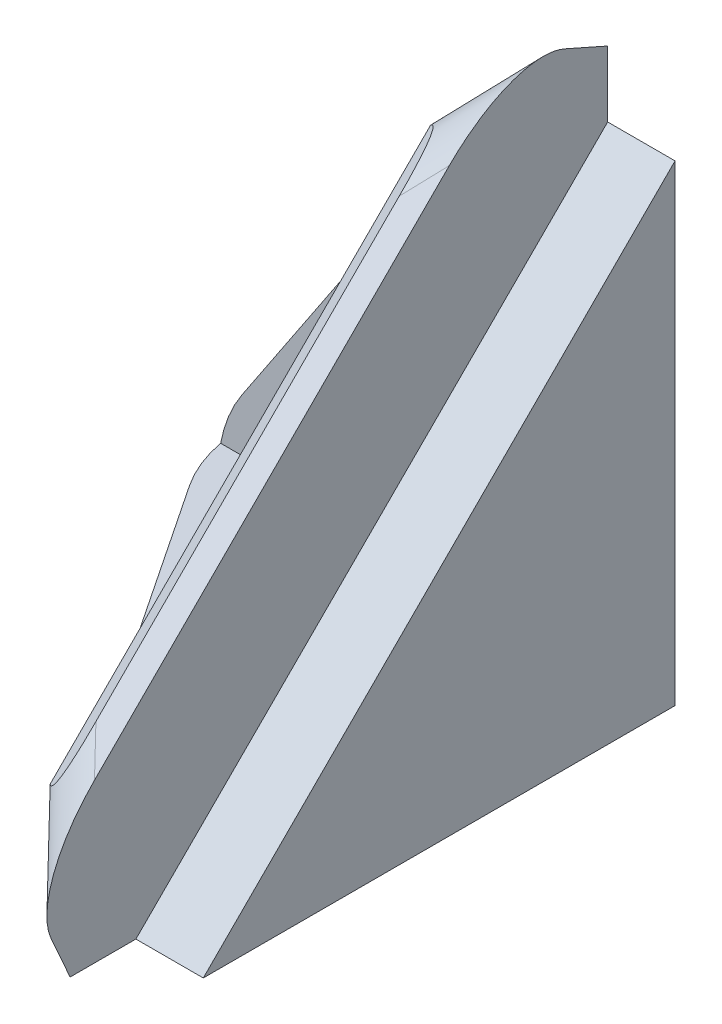
ISO-10303-21;
HEADER;
FILE_DESCRIPTION(('STEP AP214'),'2;1');
FILE_NAME('part.step','',(''),(''),'','','');
FILE_SCHEMA(('AUTOMOTIVE_DESIGN { 1 0 10303 214 1 1 1 1 }'));
ENDSEC;
DATA;
#1=APPLICATION_CONTEXT('core data for automotive mechanical design processes');
#2=APPLICATION_PROTOCOL_DEFINITION('international standard','automotive_design',2000,#1);
#3=PRODUCT_CONTEXT('',#1,'mechanical');
#4=PRODUCT('Part','Part','',(#3));
#5=PRODUCT_RELATED_PRODUCT_CATEGORY('part','',(#4));
#6=PRODUCT_DEFINITION_FORMATION('','',#4);
#7=PRODUCT_DEFINITION_CONTEXT('part definition',#1,'design');
#8=PRODUCT_DEFINITION('design','',#6,#7);
#9=PRODUCT_DEFINITION_SHAPE('','',#8);
#10=(LENGTH_UNIT() NAMED_UNIT(*) SI_UNIT(.MILLI.,.METRE.));
#11=(NAMED_UNIT(*) PLANE_ANGLE_UNIT() SI_UNIT($,.RADIAN.));
#12=(NAMED_UNIT(*) SI_UNIT($,.STERADIAN.) SOLID_ANGLE_UNIT());
#13=UNCERTAINTY_MEASURE_WITH_UNIT(LENGTH_MEASURE(1.E-05),#10,'distance_accuracy_value','');
#14=(GEOMETRIC_REPRESENTATION_CONTEXT(3) GLOBAL_UNCERTAINTY_ASSIGNED_CONTEXT((#13)) GLOBAL_UNIT_ASSIGNED_CONTEXT((#10,
#11,#12)) REPRESENTATION_CONTEXT('',''));
#15=CARTESIAN_POINT('',(0.,0.,0.));
#16=DIRECTION('',(0.,0.,1.));
#17=DIRECTION('',(1.,0.,0.));
#18=AXIS2_PLACEMENT_3D('',#15,#16,#17);
#19=CARTESIAN_POINT('',(0.,25.0502525316942,25.0502525316942));
#20=DIRECTION('',(0.0402110415282764,-0.706534879584586,-0.706534879584586));
#21=DIRECTION('',(0.,-0.707106781186547,0.707106781186547));
#22=AXIS2_PLACEMENT_3D('',#19,#20,#21);
#23=PLANE('',#22);
#24=DIRECTION('',(0.566404975696414,-0.56640497569641,0.598640799655932));
#25=VECTOR('',#24,1.);
#26=CARTESIAN_POINT('',(-12.0796495610013,18.8242886976915,30.5887268953539));
#27=LINE('',#26,#25);
#28=CARTESIAN_POINT('',(-6.85994340570037,13.6045825423906,36.1055023490589));
#29=VERTEX_POINT('',#28);
#30=CARTESIAN_POINT('',(-5.,11.7446391366902,38.071300771529));
#31=VERTEX_POINT('',#30);
#32=EDGE_CURVE('E465',#29,#31,#27,.T.);
#33=ORIENTED_EDGE('',*,*,#32,.T.);
#34=DIRECTION('',(0.,-0.707106781186548,0.707106781186548));
#35=VECTOR('',#34,1.);
#36=CARTESIAN_POINT('',(-5.,24.9079699541096,24.9079699541096));
#37=LINE('',#36,#35);
#38=CARTESIAN_POINT('',(-5.,38.071300771529,11.7446391366902));
#39=VERTEX_POINT('',#38);
#40=EDGE_CURVE('E261',#31,#39,#37,.F.);
#41=ORIENTED_EDGE('',*,*,#40,.T.);
#42=DIRECTION('',(0.566404975696415,0.598640799655932,-0.566404975696409));
#43=VECTOR('',#42,1.);
#44=CARTESIAN_POINT('',(-12.0796495610013,30.5887268953539,18.8242886976915));
#45=LINE('',#44,#43);
#46=CARTESIAN_POINT('',(-6.85994340570037,36.1055023490589,13.6045825423906));
#47=VERTEX_POINT('',#46);
#48=EDGE_CURVE('E522',#39,#47,#45,.F.);
#49=ORIENTED_EDGE('',*,*,#48,.T.);
#50=DIRECTION('',(0.,0.707106781186548,-0.707106781186548));
#51=VECTOR('',#50,1.);
#52=CARTESIAN_POINT('',(-6.85994340570037,-5.14495755427527,54.8550424457247));
#53=LINE('',#52,#51);
#54=EDGE_CURVE('E498',#29,#47,#53,.T.);
#55=ORIENTED_EDGE('',*,*,#54,.F.);
#56=EDGE_LOOP('',(#33,#41,#49,#55));
#57=FACE_BOUND('',#56,.T.);
#58=ADVANCED_FACE('F50',(#57),#23,.F.);
#59=CARTESIAN_POINT('',(-21.8679556319427,0.,14.5786370879618));
#60=DIRECTION('',(0.808003192842465,0.23867712375438,-0.53866879522831));
#61=DIRECTION('',(-0.554700196225229,0.,-0.832050294337844));
#62=AXIS2_PLACEMENT_3D('',#59,#60,#61);
#63=PLANE('',#62);
#64=DIRECTION('',(-0.554700196225229,0.,-0.832050294337844));
#65=VECTOR('',#64,1.);
#66=CARTESIAN_POINT('',(-21.8679556319427,0.,14.5786370879618));
#67=LINE('',#66,#65);
#68=CARTESIAN_POINT('',(-5.,0.,39.8805705358759));
#69=VERTEX_POINT('',#68);
#70=CARTESIAN_POINT('',(-28.9958939606416,0.,3.88672959491346));
#71=VERTEX_POINT('',#70);
#72=EDGE_CURVE('E466',#69,#71,#67,.T.);
#73=ORIENTED_EDGE('',*,*,#72,.F.);
#74=DIRECTION('',(0.,-0.914271575816795,-0.405101821340604));
#75=VECTOR('',#74,1.);
#76=CARTESIAN_POINT('',(-5.,-9.37115503531224,35.7283338555672));
#77=LINE('',#76,#75);
#78=CARTESIAN_POINT('',(-5.,3.17961836342447,41.2894179989949));
#79=VERTEX_POINT('',#78);
#80=EDGE_CURVE('E235',#69,#79,#77,.F.);
#81=ORIENTED_EDGE('',*,*,#80,.T.);
#82=DIRECTION('',(0.566404975696415,-0.56640497569641,0.598640799655932));
#83=VECTOR('',#82,1.);
#84=CARTESIAN_POINT('',(-18.4483264210769,16.6279447845013,27.0757065589623));
#85=LINE('',#84,#83);
#86=CARTESIAN_POINT('',(-9.,7.17961836342444,37.0617658748596));
#87=VERTEX_POINT('',#86);
#88=EDGE_CURVE('E536',#79,#87,#85,.F.);
#89=ORIENTED_EDGE('',*,*,#88,.T.);
#90=DIRECTION('',(0.,-0.914271575816795,-0.405101821340604));
#91=VECTOR('',#90,1.);
#92=CARTESIAN_POINT('',(-9.,-7.14891655193227,30.712978769488));
#93=LINE('',#92,#91);
#94=CARTESIAN_POINT('',(-9.,5.,36.0960053807068));
#95=VERTEX_POINT('',#94);
#96=EDGE_CURVE('E499',#95,#87,#93,.F.);
#97=ORIENTED_EDGE('',*,*,#96,.F.);
#98=DIRECTION('',(-0.554700196225229,0.,-0.832050294337844));
#99=VECTOR('',#98,1.);
#100=CARTESIAN_POINT('',(-22.8904640218647,5.,15.2603093479098));
#101=LINE('',#100,#99);
#102=CARTESIAN_POINT('',(-27.1395171905289,5.,8.88672959491345));
#103=VERTEX_POINT('',#102);
#104=EDGE_CURVE('E478',#103,#95,#101,.F.);
#105=ORIENTED_EDGE('',*,*,#104,.F.);
#106=DIRECTION('',(0.253926469367306,0.683930313758155,0.683930313758154));
#107=VECTOR('',#106,1.);
#108=CARTESIAN_POINT('',(-26.6794518107825,6.23914872011261,10.1258783150261));
#109=LINE('',#108,#107);
#110=EDGE_CURVE('E538',#103,#71,#109,.F.);
#111=ORIENTED_EDGE('',*,*,#110,.T.);
#112=EDGE_LOOP('',(#73,#81,#89,#97,#105,#111));
#113=FACE_BOUND('',#112,.T.);
#114=ADVANCED_FACE('F558',(#113),#63,.F.);
#115=CARTESIAN_POINT('',(-23.6562709283298,15.7708472855532,8.74474632195212));
#116=DIRECTION('',(-0.808003192842464,0.53866879522831,-0.238677123754382));
#117=DIRECTION('',(0.554700196225229,0.832050294337844,0.));
#118=AXIS2_PLACEMENT_3D('',#115,#116,#117);
#119=PLANE('',#118);
#120=DIRECTION('',(-0.566404975696415,-0.598640799655932,0.566404975696409));
#121=VECTOR('',#120,1.);
#122=CARTESIAN_POINT('',(-21.4232398935771,23.9314817436788,19.6028582570014));
#123=LINE('',#122,#121);
#124=CARTESIAN_POINT('',(-9.,37.0617658748596,7.17961836342443));
#125=VERTEX_POINT('',#124);
#126=CARTESIAN_POINT('',(-5.,41.2894179989949,3.17961836342447));
#127=VERTEX_POINT('',#126);
#128=EDGE_CURVE('E462',#125,#127,#123,.F.);
#129=ORIENTED_EDGE('',*,*,#128,.T.);
#130=DIRECTION('',(0.,-0.405101821340606,-0.914271575816794));
#131=VECTOR('',#130,1.);
#132=CARTESIAN_POINT('',(-5.,39.1628031074705,-1.61992448137227));
#133=LINE('',#132,#131);
#134=CARTESIAN_POINT('',(-5.,39.8805705358759,0.));
#135=VERTEX_POINT('',#134);
#136=EDGE_CURVE('E61',#127,#135,#133,.T.);
#137=ORIENTED_EDGE('',*,*,#136,.T.);
#138=DIRECTION('',(0.554700196225229,0.832050294337844,0.));
#139=VECTOR('',#138,1.);
#140=CARTESIAN_POINT('',(5.82435206036499,56.1170986264234,0.));
#141=LINE('',#140,#139);
#142=CARTESIAN_POINT('',(-28.9958939606416,3.88672959491342,0.));
#143=VERTEX_POINT('',#142);
#144=EDGE_CURVE('E463',#143,#135,#141,.T.);
#145=ORIENTED_EDGE('',*,*,#144,.F.);
#146=DIRECTION('',(-0.253926469367306,-0.683930313758155,-0.683930313758153));
#147=VECTOR('',#146,1.);
#148=CARTESIAN_POINT('',(-25.0690285072951,14.4634226363486,10.5766930414351));
#149=LINE('',#148,#147);
#150=CARTESIAN_POINT('',(-27.1395171905289,8.88672959491345,5.));
#151=VERTEX_POINT('',#150);
#152=EDGE_CURVE('E509',#143,#151,#149,.F.);
#153=ORIENTED_EDGE('',*,*,#152,.T.);
#154=DIRECTION('',(-0.554700196225229,-0.832050294337844,0.));
#155=VECTOR('',#154,1.);
#156=CARTESIAN_POINT('',(-22.8904640218647,15.2603093479098,5.));
#157=LINE('',#156,#155);
#158=CARTESIAN_POINT('',(-9.,36.0960053807069,5.));
#159=VERTEX_POINT('',#158);
#160=EDGE_CURVE('E468',#159,#151,#157,.T.);
#161=ORIENTED_EDGE('',*,*,#160,.F.);
#162=DIRECTION('',(0.,-0.405101821340606,-0.914271575816794));
#163=VECTOR('',#162,1.);
#164=CARTESIAN_POINT('',(-9.,34.1474480213914,0.602314002007703));
#165=LINE('',#164,#163);
#166=EDGE_CURVE('E519',#125,#159,#165,.T.);
#167=ORIENTED_EDGE('',*,*,#166,.F.);
#168=EDGE_LOOP('',(#129,#137,#145,#153,#161,#167));
#169=FACE_BOUND('',#168,.T.);
#170=ADVANCED_FACE('F433',(#169),#119,.T.);
#171=CARTESIAN_POINT('',(-14.4083104568646,17.8213304032732,24.3823625828208));
#172=DIRECTION('',(-0.566404975696414,0.56640497569641,-0.598640799655932));
#173=DIRECTION('',(-0.726393819624252,0.,0.687278705338445));
#174=AXIS2_PLACEMENT_3D('',#171,#172,#173);
#175=CYLINDRICAL_SURFACE('',#174,5.);
#176=ORIENTED_EDGE('',*,*,#88,.F.);
#177=CARTESIAN_POINT('',(-5.,8.41301994640867,34.3261285046927));
#178=DIRECTION('',(1.,0.,0.));
#179=DIRECTION('',(0.,0.687278705338442,-0.726393819624255));
#180=AXIS2_PLACEMENT_3D('',#177,#178,#179);
#181=ELLIPSE('',#180,8.82760606728839,5.);
#182=EDGE_CURVE('E266',#79,#31,#181,.F.);
#183=ORIENTED_EDGE('',*,*,#182,.T.);
#184=ORIENTED_EDGE('',*,*,#32,.F.);
#185=CARTESIAN_POINT('',(-11.7638692322829,15.1768891786915,27.1773069728842));
#186=DIRECTION('',(-0.727606875108999,0.485071250072666,0.485071250072666));
#187=DIRECTION('',(-0.302732240434554,0.407478411677827,-0.861576772329658));
#188=AXIS2_PLACEMENT_3D('',#185,#186,#187);
#189=ELLIPSE('',#188,12.610865810412,5.);
#190=CARTESIAN_POINT('',(-9.,9.1386762863587,37.3613237136413));
#191=VERTEX_POINT('',#190);
#192=EDGE_CURVE('E526',#191,#29,#189,.T.);
#193=ORIENTED_EDGE('',*,*,#192,.F.);
#194=CARTESIAN_POINT('',(-9.,12.4130199464086,30.0984763805574));
#195=DIRECTION('',(1.,0.,0.));
#196=DIRECTION('',(0.,0.687278705338442,-0.726393819624255));
#197=AXIS2_PLACEMENT_3D('',#194,#195,#196);
#198=ELLIPSE('',#197,8.82760606728839,5.);
#199=EDGE_CURVE('E537',#87,#191,#198,.F.);
#200=ORIENTED_EDGE('',*,*,#199,.F.);
#201=EDGE_LOOP('',(#176,#183,#184,#193,#200));
#202=FACE_BOUND('',#201,.T.);
#203=ADVANCED_FACE('F580',(#202),#175,.T.);
#204=CARTESIAN_POINT('',(-17.3832239293648,21.2381377675373,20.7962438757733));
#205=DIRECTION('',(-0.566404975696415,-0.598640799655932,0.566404975696409));
#206=DIRECTION('',(0.726393819624252,-0.687278705338446,0.));
#207=AXIS2_PLACEMENT_3D('',#204,#205,#206);
#208=CYLINDRICAL_SURFACE('',#207,5.);
#209=ORIENTED_EDGE('',*,*,#48,.F.);
#210=CARTESIAN_POINT('',(-5.,34.3261285046927,8.41301994640865));
#211=DIRECTION('',(1.,0.,0.));
#212=DIRECTION('',(0.,-0.726393819624255,0.687278705338442));
#213=AXIS2_PLACEMENT_3D('',#210,#211,#212);
#214=ELLIPSE('',#213,8.82760606728838,5.);
#215=EDGE_CURVE('E12',#39,#127,#214,.F.);
#216=ORIENTED_EDGE('',*,*,#215,.T.);
#217=ORIENTED_EDGE('',*,*,#128,.F.);
#218=CARTESIAN_POINT('',(-9.,30.0984763805574,12.4130199464086));
#219=DIRECTION('',(1.,0.,0.));
#220=DIRECTION('',(0.,-0.726393819624255,0.687278705338442));
#221=AXIS2_PLACEMENT_3D('',#218,#219,#220);
#222=ELLIPSE('',#221,8.82760606728838,5.);
#223=CARTESIAN_POINT('',(-9.,37.3613237136413,9.13867628635869));
#224=VERTEX_POINT('',#223);
#225=EDGE_CURVE('E524',#224,#125,#222,.F.);
#226=ORIENTED_EDGE('',*,*,#225,.F.);
#227=CARTESIAN_POINT('',(-11.7638692322829,27.1773069728842,15.1768891786915));
#228=DIRECTION('',(-0.727606875108999,0.485071250072666,0.485071250072666));
#229=DIRECTION('',(-0.302732240434555,-0.861576772329658,0.407478411677826));
#230=AXIS2_PLACEMENT_3D('',#227,#228,#229);
#231=ELLIPSE('',#230,12.610865810412,5.);
#232=EDGE_CURVE('E534',#47,#224,#231,.T.);
#233=ORIENTED_EDGE('',*,*,#232,.F.);
#234=EDGE_LOOP('',(#209,#216,#217,#226,#233));
#235=FACE_BOUND('',#234,.T.);
#236=ADVANCED_FACE('F47',(#235),#208,.T.);
#237=CARTESIAN_POINT('',(-12.,-0.00500999999999974,12.));
#238=DIRECTION('',(0.,1.,0.));
#239=DIRECTION('',(0.,0.,1.));
#240=AXIS2_PLACEMENT_3D('',#237,#238,#239);
#241=CYLINDRICAL_SURFACE('',#240,2.1);
#242=CARTESIAN_POINT('',(-12.,0.,12.));
#243=DIRECTION('',(0.,-1.,0.));
#244=DIRECTION('',(0.,0.,-1.));
#245=AXIS2_PLACEMENT_3D('',#242,#243,#244);
#246=CIRCLE('',#245,2.1);
#247=CARTESIAN_POINT('',(-12.,0.,9.9));
#248=VERTEX_POINT('',#247);
#249=EDGE_CURVE('E323',#248,#248,#246,.T.);
#250=ORIENTED_EDGE('',*,*,#249,.T.);
#251=EDGE_LOOP('',(#250));
#252=FACE_BOUND('',#251,.T.);
#253=CARTESIAN_POINT('',(-12.,2.5,12.));
#254=DIRECTION('',(0.,1.,0.));
#255=DIRECTION('',(0.,0.,1.));
#256=AXIS2_PLACEMENT_3D('',#253,#254,#255);
#257=CIRCLE('',#256,2.1);
#258=CARTESIAN_POINT('',(-12.,2.5,14.1));
#259=VERTEX_POINT('',#258);
#260=EDGE_CURVE('E308',#259,#259,#257,.F.);
#261=ORIENTED_EDGE('',*,*,#260,.F.);
#262=EDGE_LOOP('',(#261));
#263=FACE_BOUND('',#262,.T.);
#264=ADVANCED_FACE('F562',(#252,#263),#241,.F.);
#265=CARTESIAN_POINT('',(-12.,12.,60.00601));
#266=DIRECTION('',(0.,0.,-1.));
#267=DIRECTION('',(-1.,0.,0.));
#268=AXIS2_PLACEMENT_3D('',#265,#266,#267);
#269=CYLINDRICAL_SURFACE('',#268,2.1);
#270=CARTESIAN_POINT('',(-12.,12.,0.));
#271=DIRECTION('',(0.,0.,-1.));
#272=DIRECTION('',(-1.,0.,0.));
#273=AXIS2_PLACEMENT_3D('',#270,#271,#272);
#274=CIRCLE('',#273,2.1);
#275=CARTESIAN_POINT('',(-14.1,12.,0.));
#276=VERTEX_POINT('',#275);
#277=EDGE_CURVE('E372',#276,#276,#274,.T.);
#278=ORIENTED_EDGE('',*,*,#277,.T.);
#279=EDGE_LOOP('',(#278));
#280=FACE_BOUND('',#279,.T.);
#281=CARTESIAN_POINT('',(-12.,12.,2.5));
#282=DIRECTION('',(0.,0.,1.));
#283=DIRECTION('',(1.,0.,0.));
#284=AXIS2_PLACEMENT_3D('',#281,#282,#283);
#285=CIRCLE('',#284,2.1);
#286=CARTESIAN_POINT('',(-9.9,12.,2.5));
#287=VERTEX_POINT('',#286);
#288=EDGE_CURVE('E365',#287,#287,#285,.F.);
#289=ORIENTED_EDGE('',*,*,#288,.F.);
#290=EDGE_LOOP('',(#289));
#291=FACE_BOUND('',#290,.T.);
#292=ADVANCED_FACE('F427',(#280,#291),#269,.F.);
#293=CARTESIAN_POINT('',(0.,0.,60.));
#294=DIRECTION('',(-0.727606875108999,0.485071250072666,0.485071250072666));
#295=DIRECTION('',(0.,0.707106781186547,-0.707106781186547));
#296=AXIS2_PLACEMENT_3D('',#293,#294,#295);
#297=PLANE('',#296);
#298=DIRECTION('',(0.,-0.707106781186547,0.707106781186547));
#299=VECTOR('',#298,1.);
#300=CARTESIAN_POINT('',(-9.,23.25,23.25));
#301=LINE('',#300,#299);
#302=EDGE_CURVE('E397',#224,#191,#301,.T.);
#303=ORIENTED_EDGE('',*,*,#302,.T.);
#304=ORIENTED_EDGE('',*,*,#192,.T.);
#305=ORIENTED_EDGE('',*,*,#54,.T.);
#306=ORIENTED_EDGE('',*,*,#232,.T.);
#307=EDGE_LOOP('',(#303,#304,#305,#306));
#308=FACE_BOUND('',#307,.T.);
#309=ADVANCED_FACE('F423',(#308),#297,.T.);
#310=CARTESIAN_POINT('',(0.,0.,0.));
#311=DIRECTION('',(0.,0.,1.));
#312=DIRECTION('',(1.,0.,0.));
#313=AXIS2_PLACEMENT_3D('',#310,#311,#312);
#314=PLANE('',#313);
#315=ORIENTED_EDGE('',*,*,#277,.F.);
#316=EDGE_LOOP('',(#315));
#317=FACE_BOUND('',#316,.T.);
#318=DIRECTION('',(0.,1.,0.));
#319=VECTOR('',#318,1.);
#320=CARTESIAN_POINT('',(-5.,0.,0.));
#321=LINE('',#320,#319);
#322=CARTESIAN_POINT('',(-5.,35.,0.));
#323=VERTEX_POINT('',#322);
#324=EDGE_CURVE('E245',#323,#135,#321,.T.);
#325=ORIENTED_EDGE('',*,*,#324,.F.);
#326=DIRECTION('',(1.,0.,0.));
#327=VECTOR('',#326,1.);
#328=CARTESIAN_POINT('',(-5.,35.,0.));
#329=LINE('',#328,#327);
#330=CARTESIAN_POINT('',(0.,35.,0.));
#331=VERTEX_POINT('',#330);
#332=EDGE_CURVE('E244',#323,#331,#329,.T.);
#333=ORIENTED_EDGE('',*,*,#332,.T.);
#334=DIRECTION('',(0.,1.,0.));
#335=VECTOR('',#334,1.);
#336=CARTESIAN_POINT('',(0.,60.,0.));
#337=LINE('',#336,#335);
#338=CARTESIAN_POINT('',(0.,0.,0.));
#339=VERTEX_POINT('',#338);
#340=EDGE_CURVE('E496',#339,#331,#337,.T.);
#341=ORIENTED_EDGE('',*,*,#340,.F.);
#342=DIRECTION('',(1.,0.,0.));
#343=VECTOR('',#342,1.);
#344=CARTESIAN_POINT('',(0.,0.,0.));
#345=LINE('',#344,#343);
#346=CARTESIAN_POINT('',(-30.5683885482844,0.,0.));
#347=VERTEX_POINT('',#346);
#348=EDGE_CURVE('E457',#347,#339,#345,.T.);
#349=ORIENTED_EDGE('',*,*,#348,.F.);
#350=CARTESIAN_POINT('',(-25.3989526645243,0.,0.));
#351=DIRECTION('',(0.,0.,1.));
#352=DIRECTION('',(-0.34806030307073,-0.937472146480263,0.));
#353=AXIS2_PLACEMENT_3D('',#350,#351,#352);
#354=ELLIPSE('',#353,7.31068633663175,5.);
#355=EDGE_CURVE('E57',#347,#143,#354,.F.);
#356=ORIENTED_EDGE('',*,*,#355,.T.);
#357=ORIENTED_EDGE('',*,*,#144,.T.);
#358=EDGE_LOOP('',(#325,#333,#341,#349,#356,#357));
#359=FACE_BOUND('',#358,.T.);
#360=ADVANCED_FACE('F430',(#317,#359),#314,.F.);
#361=CARTESIAN_POINT('',(0.,0.,0.));
#362=DIRECTION('',(1.,0.,0.));
#363=DIRECTION('',(0.,0.,-1.));
#364=AXIS2_PLACEMENT_3D('',#361,#362,#363);
#365=PLANE('',#364);
#366=DIRECTION('',(0.,0.707106781186548,-0.707106781186548));
#367=VECTOR('',#366,1.);
#368=CARTESIAN_POINT('',(0.,17.5,17.5));
#369=LINE('',#368,#367);
#370=CARTESIAN_POINT('',(0.,0.,35.));
#371=VERTEX_POINT('',#370);
#372=EDGE_CURVE('E237',#371,#331,#369,.T.);
#373=ORIENTED_EDGE('',*,*,#372,.F.);
#374=DIRECTION('',(0.,0.,-1.));
#375=VECTOR('',#374,1.);
#376=CARTESIAN_POINT('',(0.,0.,60.));
#377=LINE('',#376,#375);
#378=EDGE_CURVE('E250',#371,#339,#377,.T.);
#379=ORIENTED_EDGE('',*,*,#378,.T.);
#380=ORIENTED_EDGE('',*,*,#340,.T.);
#381=EDGE_LOOP('',(#373,#379,#380));
#382=FACE_BOUND('',#381,.T.);
#383=ADVANCED_FACE('F419',(#382),#365,.T.);
#384=CARTESIAN_POINT('',(0.,0.,0.));
#385=DIRECTION('',(0.,-1.,0.));
#386=DIRECTION('',(0.,0.,1.));
#387=AXIS2_PLACEMENT_3D('',#384,#385,#386);
#388=PLANE('',#387);
#389=DIRECTION('',(1.,0.,0.));
#390=VECTOR('',#389,1.);
#391=CARTESIAN_POINT('',(-5.,0.,35.));
#392=LINE('',#391,#390);
#393=CARTESIAN_POINT('',(-5.,0.,35.));
#394=VERTEX_POINT('',#393);
#395=EDGE_CURVE('E236',#394,#371,#392,.T.);
#396=ORIENTED_EDGE('',*,*,#395,.F.);
#397=DIRECTION('',(0.,0.,1.));
#398=VECTOR('',#397,1.);
#399=CARTESIAN_POINT('',(-5.,0.,0.));
#400=LINE('',#399,#398);
#401=EDGE_CURVE('E227',#394,#69,#400,.T.);
#402=ORIENTED_EDGE('',*,*,#401,.T.);
#403=ORIENTED_EDGE('',*,*,#72,.T.);
#404=CARTESIAN_POINT('',(-25.3989526645243,0.,0.));
#405=DIRECTION('',(0.,-1.,0.));
#406=DIRECTION('',(-0.348060303070731,0.,-0.937472146480263));
#407=AXIS2_PLACEMENT_3D('',#404,#405,#406);
#408=ELLIPSE('',#407,7.31068633663173,5.);
#409=EDGE_CURVE('E459',#71,#347,#408,.T.);
#410=ORIENTED_EDGE('',*,*,#409,.T.);
#411=ORIENTED_EDGE('',*,*,#348,.T.);
#412=ORIENTED_EDGE('',*,*,#378,.F.);
#413=EDGE_LOOP('',(#396,#402,#403,#410,#411,#412));
#414=FACE_BOUND('',#413,.T.);
#415=ORIENTED_EDGE('',*,*,#249,.F.);
#416=EDGE_LOOP('',(#415));
#417=FACE_BOUND('',#416,.T.);
#418=ADVANCED_FACE('F248',(#414,#417),#388,.T.);
#419=CARTESIAN_POINT('',(0.,0.,5.));
#420=DIRECTION('',(0.,0.,1.));
#421=DIRECTION('',(1.,0.,0.));
#422=AXIS2_PLACEMENT_3D('',#419,#420,#421);
#423=PLANE('',#422);
#424=DIRECTION('',(-0.866025403784439,0.5,0.));
#425=VECTOR('',#424,1.);
#426=CARTESIAN_POINT('',(-8.5,14.0207259421637,5.));
#427=LINE('',#426,#425);
#428=CARTESIAN_POINT('',(-8.5,14.0207259421637,5.));
#429=VERTEX_POINT('',#428);
#430=CARTESIAN_POINT('',(-12.,16.0414518843274,5.));
#431=VERTEX_POINT('',#430);
#432=EDGE_CURVE('E325',#429,#431,#427,.T.);
#433=ORIENTED_EDGE('',*,*,#432,.F.);
#434=DIRECTION('',(0.,1.,0.));
#435=VECTOR('',#434,1.);
#436=CARTESIAN_POINT('',(-8.5,9.97927405783631,5.));
#437=LINE('',#436,#435);
#438=CARTESIAN_POINT('',(-8.5,9.97927405783631,5.));
#439=VERTEX_POINT('',#438);
#440=EDGE_CURVE('E329',#439,#429,#437,.T.);
#441=ORIENTED_EDGE('',*,*,#440,.F.);
#442=DIRECTION('',(0.866025403784439,0.5,0.));
#443=VECTOR('',#442,1.);
#444=CARTESIAN_POINT('',(-12.,7.95854811567262,5.));
#445=LINE('',#444,#443);
#446=CARTESIAN_POINT('',(-12.,7.95854811567262,5.));
#447=VERTEX_POINT('',#446);
#448=EDGE_CURVE('E354',#447,#439,#445,.T.);
#449=ORIENTED_EDGE('',*,*,#448,.F.);
#450=DIRECTION('',(0.866025403784438,-0.5,0.));
#451=VECTOR('',#450,1.);
#452=CARTESIAN_POINT('',(-15.5,9.97927405783631,5.));
#453=LINE('',#452,#451);
#454=CARTESIAN_POINT('',(-15.5,9.97927405783631,5.));
#455=VERTEX_POINT('',#454);
#456=EDGE_CURVE('E355',#455,#447,#453,.T.);
#457=ORIENTED_EDGE('',*,*,#456,.F.);
#458=DIRECTION('',(0.,-1.,0.));
#459=VECTOR('',#458,1.);
#460=CARTESIAN_POINT('',(-15.5,14.0207259421637,5.));
#461=LINE('',#460,#459);
#462=CARTESIAN_POINT('',(-15.5,14.0207259421637,5.));
#463=VERTEX_POINT('',#462);
#464=EDGE_CURVE('E347',#463,#455,#461,.T.);
#465=ORIENTED_EDGE('',*,*,#464,.F.);
#466=DIRECTION('',(-0.866025403784438,-0.5,0.));
#467=VECTOR('',#466,1.);
#468=CARTESIAN_POINT('',(-12.,16.0414518843274,5.));
#469=LINE('',#468,#467);
#470=EDGE_CURVE('E346',#431,#463,#469,.T.);
#471=ORIENTED_EDGE('',*,*,#470,.F.);
#472=EDGE_LOOP('',(#433,#441,#449,#457,#465,#471));
#473=FACE_BOUND('',#472,.T.);
#474=ORIENTED_EDGE('',*,*,#160,.T.);
#475=CARTESIAN_POINT('',(-23.5425758944116,4.99999999999999,5.));
#476=DIRECTION('',(0.,0.,1.));
#477=DIRECTION('',(-0.34806030307073,-0.937472146480263,0.));
#478=AXIS2_PLACEMENT_3D('',#475,#476,#477);
#479=ELLIPSE('',#478,7.31068633663175,5.);
#480=CARTESIAN_POINT('',(-28.7120117781717,5.,5.));
#481=VERTEX_POINT('',#480);
#482=EDGE_CURVE('E73',#151,#481,#479,.T.);
#483=ORIENTED_EDGE('',*,*,#482,.T.);
#484=DIRECTION('',(1.,0.,0.));
#485=VECTOR('',#484,1.);
#486=CARTESIAN_POINT('',(0.,5.,5.));
#487=LINE('',#486,#485);
#488=CARTESIAN_POINT('',(-4.,5.,5.));
#489=VERTEX_POINT('',#488);
#490=EDGE_CURVE('E399',#481,#489,#487,.T.);
#491=ORIENTED_EDGE('',*,*,#490,.T.);
#492=DIRECTION('',(0.,-1.,0.));
#493=VECTOR('',#492,1.);
#494=CARTESIAN_POINT('',(-4.,22.5,5.));
#495=LINE('',#494,#493);
#496=CARTESIAN_POINT('',(-4.,22.5,5.));
#497=VERTEX_POINT('',#496);
#498=EDGE_CURVE('E380',#497,#489,#495,.T.);
#499=ORIENTED_EDGE('',*,*,#498,.F.);
#500=DIRECTION('',(-1.,0.,0.));
#501=VECTOR('',#500,1.);
#502=CARTESIAN_POINT('',(-4.,22.5,5.));
#503=LINE('',#502,#501);
#504=CARTESIAN_POINT('',(-9.,22.5,5.));
#505=VERTEX_POINT('',#504);
#506=EDGE_CURVE('E386',#497,#505,#503,.T.);
#507=ORIENTED_EDGE('',*,*,#506,.T.);
#508=DIRECTION('',(0.,1.,0.));
#509=VECTOR('',#508,1.);
#510=CARTESIAN_POINT('',(-9.,0.,5.));
#511=LINE('',#510,#509);
#512=EDGE_CURVE('E391',#505,#159,#511,.T.);
#513=ORIENTED_EDGE('',*,*,#512,.T.);
#514=EDGE_LOOP('',(#474,#483,#491,#499,#507,#513));
#515=FACE_BOUND('',#514,.T.);
#516=ADVANCED_FACE('F417',(#473,#515),#423,.T.);
#517=CARTESIAN_POINT('',(-9.,0.,0.));
#518=DIRECTION('',(1.,0.,0.));
#519=DIRECTION('',(0.,0.,-1.));
#520=AXIS2_PLACEMENT_3D('',#517,#518,#519);
#521=PLANE('',#520);
#522=ORIENTED_EDGE('',*,*,#96,.T.);
#523=ORIENTED_EDGE('',*,*,#199,.T.);
#524=ORIENTED_EDGE('',*,*,#302,.F.);
#525=ORIENTED_EDGE('',*,*,#225,.T.);
#526=ORIENTED_EDGE('',*,*,#166,.T.);
#527=ORIENTED_EDGE('',*,*,#512,.F.);
#528=DIRECTION('',(0.,0.707106781186548,-0.707106781186548));
#529=VECTOR('',#528,1.);
#530=CARTESIAN_POINT('',(-9.,22.5,5.));
#531=LINE('',#530,#529);
#532=CARTESIAN_POINT('',(-9.,5.,22.5));
#533=VERTEX_POINT('',#532);
#534=EDGE_CURVE('E377',#533,#505,#531,.T.);
#535=ORIENTED_EDGE('',*,*,#534,.F.);
#536=DIRECTION('',(0.,0.,-1.));
#537=VECTOR('',#536,1.);
#538=CARTESIAN_POINT('',(-9.,5.,0.));
#539=LINE('',#538,#537);
#540=EDGE_CURVE('E392',#95,#533,#539,.T.);
#541=ORIENTED_EDGE('',*,*,#540,.F.);
#542=EDGE_LOOP('',(#522,#523,#524,#525,#526,#527,#535,#541));
#543=FACE_BOUND('',#542,.T.);
#544=ADVANCED_FACE('F554',(#543),#521,.F.);
#545=CARTESIAN_POINT('',(0.,5.,0.));
#546=DIRECTION('',(0.,-1.,0.));
#547=DIRECTION('',(0.,0.,1.));
#548=AXIS2_PLACEMENT_3D('',#545,#546,#547);
#549=PLANE('',#548);
#550=DIRECTION('',(-0.866025403784439,0.,0.5));
#551=VECTOR('',#550,1.);
#552=CARTESIAN_POINT('',(-12.,5.,7.95854811567262));
#553=LINE('',#552,#551);
#554=CARTESIAN_POINT('',(-12.,5.,7.95854811567262));
#555=VERTEX_POINT('',#554);
#556=CARTESIAN_POINT('',(-15.5,5.,9.97927405783631));
#557=VERTEX_POINT('',#556);
#558=EDGE_CURVE('E291',#555,#557,#553,.T.);
#559=ORIENTED_EDGE('',*,*,#558,.F.);
#560=DIRECTION('',(-0.866025403784439,0.,-0.5));
#561=VECTOR('',#560,1.);
#562=CARTESIAN_POINT('',(-8.5,5.,9.97927405783631));
#563=LINE('',#562,#561);
#564=CARTESIAN_POINT('',(-8.5,5.,9.97927405783631));
#565=VERTEX_POINT('',#564);
#566=EDGE_CURVE('E269',#565,#555,#563,.T.);
#567=ORIENTED_EDGE('',*,*,#566,.F.);
#568=DIRECTION('',(0.,0.,-1.));
#569=VECTOR('',#568,1.);
#570=CARTESIAN_POINT('',(-8.5,5.,14.0207259421637));
#571=LINE('',#570,#569);
#572=CARTESIAN_POINT('',(-8.5,5.,14.0207259421637));
#573=VERTEX_POINT('',#572);
#574=EDGE_CURVE('E280',#573,#565,#571,.T.);
#575=ORIENTED_EDGE('',*,*,#574,.F.);
#576=DIRECTION('',(0.866025403784439,0.,-0.5));
#577=VECTOR('',#576,1.);
#578=CARTESIAN_POINT('',(-12.,5.,16.0414518843274));
#579=LINE('',#578,#577);
#580=CARTESIAN_POINT('',(-12.,5.,16.0414518843274));
#581=VERTEX_POINT('',#580);
#582=EDGE_CURVE('E303',#581,#573,#579,.T.);
#583=ORIENTED_EDGE('',*,*,#582,.F.);
#584=DIRECTION('',(0.866025403784439,0.,0.5));
#585=VECTOR('',#584,1.);
#586=CARTESIAN_POINT('',(-15.5,5.,14.0207259421637));
#587=LINE('',#586,#585);
#588=CARTESIAN_POINT('',(-15.5,5.,14.0207259421637));
#589=VERTEX_POINT('',#588);
#590=EDGE_CURVE('E296',#589,#581,#587,.T.);
#591=ORIENTED_EDGE('',*,*,#590,.F.);
#592=DIRECTION('',(0.,0.,1.));
#593=VECTOR('',#592,1.);
#594=CARTESIAN_POINT('',(-15.5,5.,9.97927405783631));
#595=LINE('',#594,#593);
#596=EDGE_CURVE('E299',#557,#589,#595,.T.);
#597=ORIENTED_EDGE('',*,*,#596,.F.);
#598=EDGE_LOOP('',(#559,#567,#575,#583,#591,#597));
#599=FACE_BOUND('',#598,.T.);
#600=ORIENTED_EDGE('',*,*,#490,.F.);
#601=CARTESIAN_POINT('',(-23.5425758944116,5.,5.00000000000001));
#602=DIRECTION('',(0.,-1.,0.));
#603=DIRECTION('',(-0.348060303070731,0.,-0.937472146480263));
#604=AXIS2_PLACEMENT_3D('',#601,#602,#603);
#605=ELLIPSE('',#604,7.31068633663173,5.);
#606=EDGE_CURVE('E507',#481,#103,#605,.F.);
#607=ORIENTED_EDGE('',*,*,#606,.T.);
#608=ORIENTED_EDGE('',*,*,#104,.T.);
#609=ORIENTED_EDGE('',*,*,#540,.T.);
#610=DIRECTION('',(-1.,0.,0.));
#611=VECTOR('',#610,1.);
#612=CARTESIAN_POINT('',(-4.,5.,22.5));
#613=LINE('',#612,#611);
#614=CARTESIAN_POINT('',(-4.,5.,22.5));
#615=VERTEX_POINT('',#614);
#616=EDGE_CURVE('E387',#615,#533,#613,.T.);
#617=ORIENTED_EDGE('',*,*,#616,.F.);
#618=DIRECTION('',(0.,0.,1.));
#619=VECTOR('',#618,1.);
#620=CARTESIAN_POINT('',(-4.,5.,5.));
#621=LINE('',#620,#619);
#622=EDGE_CURVE('E376',#489,#615,#621,.T.);
#623=ORIENTED_EDGE('',*,*,#622,.F.);
#624=EDGE_LOOP('',(#600,#607,#608,#609,#617,#623));
#625=FACE_BOUND('',#624,.T.);
#626=ADVANCED_FACE('F547',(#599,#625),#549,.F.);
#627=CARTESIAN_POINT('',(-4.,22.5,5.));
#628=DIRECTION('',(0.,0.707106781186548,0.707106781186548));
#629=DIRECTION('',(0.,-0.707106781186548,0.707106781186548));
#630=AXIS2_PLACEMENT_3D('',#627,#628,#629);
#631=PLANE('',#630);
#632=ORIENTED_EDGE('',*,*,#534,.T.);
#633=ORIENTED_EDGE('',*,*,#506,.F.);
#634=DIRECTION('',(0.,0.707106781186548,-0.707106781186548));
#635=VECTOR('',#634,1.);
#636=CARTESIAN_POINT('',(-4.,22.5,5.));
#637=LINE('',#636,#635);
#638=EDGE_CURVE('E381',#615,#497,#637,.T.);
#639=ORIENTED_EDGE('',*,*,#638,.F.);
#640=ORIENTED_EDGE('',*,*,#616,.T.);
#641=EDGE_LOOP('',(#632,#633,#639,#640));
#642=FACE_BOUND('',#641,.T.);
#643=ADVANCED_FACE('F606',(#642),#631,.F.);
#644=CARTESIAN_POINT('',(-4.,0.,0.));
#645=DIRECTION('',(-1.,0.,0.));
#646=DIRECTION('',(0.,0.,1.));
#647=AXIS2_PLACEMENT_3D('',#644,#645,#646);
#648=PLANE('',#647);
#649=ORIENTED_EDGE('',*,*,#498,.T.);
#650=ORIENTED_EDGE('',*,*,#622,.T.);
#651=ORIENTED_EDGE('',*,*,#638,.T.);
#652=EDGE_LOOP('',(#649,#650,#651));
#653=FACE_BOUND('',#652,.T.);
#654=ADVANCED_FACE('F612',(#653),#648,.T.);
#655=CARTESIAN_POINT('',(0.,0.,2.5));
#656=DIRECTION('',(0.,0.,1.));
#657=DIRECTION('',(1.,0.,0.));
#658=AXIS2_PLACEMENT_3D('',#655,#656,#657);
#659=PLANE('',#658);
#660=DIRECTION('',(-0.866025403784439,0.5,0.));
#661=VECTOR('',#660,1.);
#662=CARTESIAN_POINT('',(-8.5,14.0207259421637,2.5));
#663=LINE('',#662,#661);
#664=CARTESIAN_POINT('',(-8.5,14.0207259421637,2.5));
#665=VERTEX_POINT('',#664);
#666=CARTESIAN_POINT('',(-12.,16.0414518843274,2.5));
#667=VERTEX_POINT('',#666);
#668=EDGE_CURVE('E321',#665,#667,#663,.T.);
#669=ORIENTED_EDGE('',*,*,#668,.T.);
#670=DIRECTION('',(-0.866025403784438,-0.5,0.));
#671=VECTOR('',#670,1.);
#672=CARTESIAN_POINT('',(-12.,16.0414518843274,2.5));
#673=LINE('',#672,#671);
#674=CARTESIAN_POINT('',(-15.5,14.0207259421637,2.5));
#675=VERTEX_POINT('',#674);
#676=EDGE_CURVE('E328',#667,#675,#673,.T.);
#677=ORIENTED_EDGE('',*,*,#676,.T.);
#678=DIRECTION('',(0.,-1.,0.));
#679=VECTOR('',#678,1.);
#680=CARTESIAN_POINT('',(-15.5,14.0207259421637,2.5));
#681=LINE('',#680,#679);
#682=CARTESIAN_POINT('',(-15.5,9.97927405783631,2.5));
#683=VERTEX_POINT('',#682);
#684=EDGE_CURVE('E332',#675,#683,#681,.T.);
#685=ORIENTED_EDGE('',*,*,#684,.T.);
#686=DIRECTION('',(0.866025403784438,-0.5,0.));
#687=VECTOR('',#686,1.);
#688=CARTESIAN_POINT('',(-15.5,9.97927405783631,2.5));
#689=LINE('',#688,#687);
#690=CARTESIAN_POINT('',(-12.,7.95854811567262,2.5));
#691=VERTEX_POINT('',#690);
#692=EDGE_CURVE('E334',#683,#691,#689,.T.);
#693=ORIENTED_EDGE('',*,*,#692,.T.);
#694=DIRECTION('',(0.866025403784439,0.5,0.));
#695=VECTOR('',#694,1.);
#696=CARTESIAN_POINT('',(-12.,7.95854811567262,2.5));
#697=LINE('',#696,#695);
#698=CARTESIAN_POINT('',(-8.5,9.97927405783631,2.5));
#699=VERTEX_POINT('',#698);
#700=EDGE_CURVE('E336',#691,#699,#697,.T.);
#701=ORIENTED_EDGE('',*,*,#700,.T.);
#702=DIRECTION('',(0.,1.,0.));
#703=VECTOR('',#702,1.);
#704=CARTESIAN_POINT('',(-8.5,9.97927405783631,2.5));
#705=LINE('',#704,#703);
#706=EDGE_CURVE('E341',#699,#665,#705,.T.);
#707=ORIENTED_EDGE('',*,*,#706,.T.);
#708=EDGE_LOOP('',(#669,#677,#685,#693,#701,#707));
#709=FACE_BOUND('',#708,.T.);
#710=ORIENTED_EDGE('',*,*,#288,.T.);
#711=EDGE_LOOP('',(#710));
#712=FACE_BOUND('',#711,.T.);
#713=ADVANCED_FACE('F614',(#709,#712),#659,.T.);
#714=CARTESIAN_POINT('',(-8.5,14.0207259421637,2.5));
#715=DIRECTION('',(0.5,0.866025403784439,0.));
#716=DIRECTION('',(-0.866025403784439,0.5,0.));
#717=AXIS2_PLACEMENT_3D('',#714,#715,#716);
#718=PLANE('',#717);
#719=ORIENTED_EDGE('',*,*,#432,.T.);
#720=DIRECTION('',(0.,0.,1.));
#721=VECTOR('',#720,1.);
#722=CARTESIAN_POINT('',(-12.,16.0414518843274,2.5));
#723=LINE('',#722,#721);
#724=EDGE_CURVE('E342',#667,#431,#723,.T.);
#725=ORIENTED_EDGE('',*,*,#724,.F.);
#726=ORIENTED_EDGE('',*,*,#668,.F.);
#727=DIRECTION('',(0.,0.,1.));
#728=VECTOR('',#727,1.);
#729=CARTESIAN_POINT('',(-8.5,14.0207259421637,2.5));
#730=LINE('',#729,#728);
#731=EDGE_CURVE('E358',#665,#429,#730,.T.);
#732=ORIENTED_EDGE('',*,*,#731,.T.);
#733=EDGE_LOOP('',(#719,#725,#726,#732));
#734=FACE_BOUND('',#733,.T.);
#735=ADVANCED_FACE('F616',(#734),#718,.F.);
#736=CARTESIAN_POINT('',(-8.5,9.97927405783631,2.5));
#737=DIRECTION('',(1.,0.,0.));
#738=DIRECTION('',(0.,0.,-1.));
#739=AXIS2_PLACEMENT_3D('',#736,#737,#738);
#740=PLANE('',#739);
#741=ORIENTED_EDGE('',*,*,#440,.T.);
#742=ORIENTED_EDGE('',*,*,#731,.F.);
#743=ORIENTED_EDGE('',*,*,#706,.F.);
#744=DIRECTION('',(0.,0.,1.));
#745=VECTOR('',#744,1.);
#746=CARTESIAN_POINT('',(-8.5,9.97927405783631,2.5));
#747=LINE('',#746,#745);
#748=EDGE_CURVE('E364',#699,#439,#747,.T.);
#749=ORIENTED_EDGE('',*,*,#748,.T.);
#750=EDGE_LOOP('',(#741,#742,#743,#749));
#751=FACE_BOUND('',#750,.T.);
#752=ADVANCED_FACE('F733',(#751),#740,.F.);
#753=CARTESIAN_POINT('',(-12.,7.95854811567262,2.5));
#754=DIRECTION('',(0.5,-0.866025403784438,0.));
#755=DIRECTION('',(0.866025403784439,0.5,0.));
#756=AXIS2_PLACEMENT_3D('',#753,#754,#755);
#757=PLANE('',#756);
#758=ORIENTED_EDGE('',*,*,#448,.T.);
#759=ORIENTED_EDGE('',*,*,#748,.F.);
#760=ORIENTED_EDGE('',*,*,#700,.F.);
#761=DIRECTION('',(0.,0.,1.));
#762=VECTOR('',#761,1.);
#763=CARTESIAN_POINT('',(-12.,7.95854811567262,2.5));
#764=LINE('',#763,#762);
#765=EDGE_CURVE('E363',#691,#447,#764,.T.);
#766=ORIENTED_EDGE('',*,*,#765,.T.);
#767=EDGE_LOOP('',(#758,#759,#760,#766));
#768=FACE_BOUND('',#767,.T.);
#769=ADVANCED_FACE('F741',(#768),#757,.F.);
#770=CARTESIAN_POINT('',(-15.5,9.97927405783631,2.5));
#771=DIRECTION('',(-0.5,-0.866025403784438,0.));
#772=DIRECTION('',(0.866025403784439,-0.5,0.));
#773=AXIS2_PLACEMENT_3D('',#770,#771,#772);
#774=PLANE('',#773);
#775=ORIENTED_EDGE('',*,*,#456,.T.);
#776=ORIENTED_EDGE('',*,*,#765,.F.);
#777=ORIENTED_EDGE('',*,*,#692,.F.);
#778=DIRECTION('',(0.,0.,1.));
#779=VECTOR('',#778,1.);
#780=CARTESIAN_POINT('',(-15.5,9.97927405783631,2.5));
#781=LINE('',#780,#779);
#782=EDGE_CURVE('E369',#683,#455,#781,.T.);
#783=ORIENTED_EDGE('',*,*,#782,.T.);
#784=EDGE_LOOP('',(#775,#776,#777,#783));
#785=FACE_BOUND('',#784,.T.);
#786=ADVANCED_FACE('F754',(#785),#774,.F.);
#787=CARTESIAN_POINT('',(-15.5,14.0207259421637,2.5));
#788=DIRECTION('',(-1.,0.,0.));
#789=DIRECTION('',(0.,0.,1.));
#790=AXIS2_PLACEMENT_3D('',#787,#788,#789);
#791=PLANE('',#790);
#792=ORIENTED_EDGE('',*,*,#464,.T.);
#793=ORIENTED_EDGE('',*,*,#782,.F.);
#794=ORIENTED_EDGE('',*,*,#684,.F.);
#795=DIRECTION('',(0.,0.,1.));
#796=VECTOR('',#795,1.);
#797=CARTESIAN_POINT('',(-15.5,14.0207259421637,2.5));
#798=LINE('',#797,#796);
#799=EDGE_CURVE('E366',#675,#463,#798,.T.);
#800=ORIENTED_EDGE('',*,*,#799,.T.);
#801=EDGE_LOOP('',(#792,#793,#794,#800));
#802=FACE_BOUND('',#801,.T.);
#803=ADVANCED_FACE('F659',(#802),#791,.F.);
#804=CARTESIAN_POINT('',(-12.,16.0414518843274,2.5));
#805=DIRECTION('',(-0.5,0.866025403784438,0.));
#806=DIRECTION('',(-0.866025403784438,-0.5,0.));
#807=AXIS2_PLACEMENT_3D('',#804,#805,#806);
#808=PLANE('',#807);
#809=ORIENTED_EDGE('',*,*,#470,.T.);
#810=ORIENTED_EDGE('',*,*,#799,.F.);
#811=ORIENTED_EDGE('',*,*,#676,.F.);
#812=ORIENTED_EDGE('',*,*,#724,.T.);
#813=EDGE_LOOP('',(#809,#810,#811,#812));
#814=FACE_BOUND('',#813,.T.);
#815=ADVANCED_FACE('F652',(#814),#808,.F.);
#816=CARTESIAN_POINT('',(0.,2.5,0.));
#817=DIRECTION('',(0.,1.,0.));
#818=DIRECTION('',(0.,0.,1.));
#819=AXIS2_PLACEMENT_3D('',#816,#817,#818);
#820=PLANE('',#819);
#821=DIRECTION('',(-0.866025403784439,0.,-0.5));
#822=VECTOR('',#821,1.);
#823=CARTESIAN_POINT('',(-8.5,2.5,9.97927405783631));
#824=LINE('',#823,#822);
#825=CARTESIAN_POINT('',(-8.5,2.5,9.97927405783631));
#826=VERTEX_POINT('',#825);
#827=CARTESIAN_POINT('',(-12.,2.5,7.95854811567262));
#828=VERTEX_POINT('',#827);
#829=EDGE_CURVE('E273',#826,#828,#824,.T.);
#830=ORIENTED_EDGE('',*,*,#829,.T.);
#831=DIRECTION('',(-0.866025403784439,0.,0.5));
#832=VECTOR('',#831,1.);
#833=CARTESIAN_POINT('',(-12.,2.5,7.95854811567262));
#834=LINE('',#833,#832);
#835=CARTESIAN_POINT('',(-15.5,2.5,9.97927405783631));
#836=VERTEX_POINT('',#835);
#837=EDGE_CURVE('E276',#828,#836,#834,.T.);
#838=ORIENTED_EDGE('',*,*,#837,.T.);
#839=DIRECTION('',(0.,0.,1.));
#840=VECTOR('',#839,1.);
#841=CARTESIAN_POINT('',(-15.5,2.5,9.97927405783631));
#842=LINE('',#841,#840);
#843=CARTESIAN_POINT('',(-15.5,2.5,14.0207259421637));
#844=VERTEX_POINT('',#843);
#845=EDGE_CURVE('E279',#836,#844,#842,.T.);
#846=ORIENTED_EDGE('',*,*,#845,.T.);
#847=DIRECTION('',(0.866025403784439,0.,0.5));
#848=VECTOR('',#847,1.);
#849=CARTESIAN_POINT('',(-15.5,2.5,14.0207259421637));
#850=LINE('',#849,#848);
#851=CARTESIAN_POINT('',(-12.,2.5,16.0414518843274));
#852=VERTEX_POINT('',#851);
#853=EDGE_CURVE('E284',#844,#852,#850,.T.);
#854=ORIENTED_EDGE('',*,*,#853,.T.);
#855=DIRECTION('',(0.866025403784439,0.,-0.5));
#856=VECTOR('',#855,1.);
#857=CARTESIAN_POINT('',(-12.,2.5,16.0414518843274));
#858=LINE('',#857,#856);
#859=CARTESIAN_POINT('',(-8.5,2.5,14.0207259421637));
#860=VERTEX_POINT('',#859);
#861=EDGE_CURVE('E287',#852,#860,#858,.T.);
#862=ORIENTED_EDGE('',*,*,#861,.T.);
#863=DIRECTION('',(0.,0.,-1.));
#864=VECTOR('',#863,1.);
#865=CARTESIAN_POINT('',(-8.5,2.5,14.0207259421637));
#866=LINE('',#865,#864);
#867=EDGE_CURVE('E286',#860,#826,#866,.T.);
#868=ORIENTED_EDGE('',*,*,#867,.T.);
#869=EDGE_LOOP('',(#830,#838,#846,#854,#862,#868));
#870=FACE_BOUND('',#869,.T.);
#871=ORIENTED_EDGE('',*,*,#260,.T.);
#872=EDGE_LOOP('',(#871));
#873=FACE_BOUND('',#872,.T.);
#874=ADVANCED_FACE('F561',(#870,#873),#820,.T.);
#875=CARTESIAN_POINT('',(-8.5,2.5,9.97927405783631));
#876=DIRECTION('',(0.5,0.,-0.866025403784439));
#877=DIRECTION('',(-0.866025403784439,0.,-0.5));
#878=AXIS2_PLACEMENT_3D('',#875,#876,#877);
#879=PLANE('',#878);
#880=ORIENTED_EDGE('',*,*,#566,.T.);
#881=DIRECTION('',(0.,1.,0.));
#882=VECTOR('',#881,1.);
#883=CARTESIAN_POINT('',(-12.,2.5,7.95854811567262));
#884=LINE('',#883,#882);
#885=EDGE_CURVE('E294',#828,#555,#884,.T.);
#886=ORIENTED_EDGE('',*,*,#885,.F.);
#887=ORIENTED_EDGE('',*,*,#829,.F.);
#888=DIRECTION('',(0.,1.,0.));
#889=VECTOR('',#888,1.);
#890=CARTESIAN_POINT('',(-8.5,2.5,9.97927405783631));
#891=LINE('',#890,#889);
#892=EDGE_CURVE('E306',#826,#565,#891,.T.);
#893=ORIENTED_EDGE('',*,*,#892,.T.);
#894=EDGE_LOOP('',(#880,#886,#887,#893));
#895=FACE_BOUND('',#894,.T.);
#896=ADVANCED_FACE('F637',(#895),#879,.F.);
#897=CARTESIAN_POINT('',(-8.5,2.5,14.0207259421637));
#898=DIRECTION('',(1.,0.,0.));
#899=DIRECTION('',(0.,0.,-1.));
#900=AXIS2_PLACEMENT_3D('',#897,#898,#899);
#901=PLANE('',#900);
#902=ORIENTED_EDGE('',*,*,#574,.T.);
#903=ORIENTED_EDGE('',*,*,#892,.F.);
#904=ORIENTED_EDGE('',*,*,#867,.F.);
#905=DIRECTION('',(0.,1.,0.));
#906=VECTOR('',#905,1.);
#907=CARTESIAN_POINT('',(-8.5,2.5,14.0207259421637));
#908=LINE('',#907,#906);
#909=EDGE_CURVE('E312',#860,#573,#908,.T.);
#910=ORIENTED_EDGE('',*,*,#909,.T.);
#911=EDGE_LOOP('',(#902,#903,#904,#910));
#912=FACE_BOUND('',#911,.T.);
#913=ADVANCED_FACE('F643',(#912),#901,.F.);
#914=CARTESIAN_POINT('',(-12.,2.5,16.0414518843274));
#915=DIRECTION('',(0.5,0.,0.866025403784439));
#916=DIRECTION('',(0.866025403784439,0.,-0.5));
#917=AXIS2_PLACEMENT_3D('',#914,#915,#916);
#918=PLANE('',#917);
#919=ORIENTED_EDGE('',*,*,#582,.T.);
#920=ORIENTED_EDGE('',*,*,#909,.F.);
#921=ORIENTED_EDGE('',*,*,#861,.F.);
#922=DIRECTION('',(0.,1.,0.));
#923=VECTOR('',#922,1.);
#924=CARTESIAN_POINT('',(-12.,2.5,16.0414518843274));
#925=LINE('',#924,#923);
#926=EDGE_CURVE('E314',#852,#581,#925,.T.);
#927=ORIENTED_EDGE('',*,*,#926,.T.);
#928=EDGE_LOOP('',(#919,#920,#921,#927));
#929=FACE_BOUND('',#928,.T.);
#930=ADVANCED_FACE('F646',(#929),#918,.F.);
#931=CARTESIAN_POINT('',(-15.5,2.5,14.0207259421637));
#932=DIRECTION('',(-0.5,0.,0.866025403784438));
#933=DIRECTION('',(0.866025403784439,0.,0.5));
#934=AXIS2_PLACEMENT_3D('',#931,#932,#933);
#935=PLANE('',#934);
#936=ORIENTED_EDGE('',*,*,#590,.T.);
#937=ORIENTED_EDGE('',*,*,#926,.F.);
#938=ORIENTED_EDGE('',*,*,#853,.F.);
#939=DIRECTION('',(0.,1.,0.));
#940=VECTOR('',#939,1.);
#941=CARTESIAN_POINT('',(-15.5,2.5,14.0207259421637));
#942=LINE('',#941,#940);
#943=EDGE_CURVE('E313',#844,#589,#942,.T.);
#944=ORIENTED_EDGE('',*,*,#943,.T.);
#945=EDGE_LOOP('',(#936,#937,#938,#944));
#946=FACE_BOUND('',#945,.T.);
#947=ADVANCED_FACE('F649',(#946),#935,.F.);
#948=CARTESIAN_POINT('',(-15.5,2.5,9.97927405783631));
#949=DIRECTION('',(-1.,0.,0.));
#950=DIRECTION('',(0.,0.,1.));
#951=AXIS2_PLACEMENT_3D('',#948,#949,#950);
#952=PLANE('',#951);
#953=ORIENTED_EDGE('',*,*,#596,.T.);
#954=ORIENTED_EDGE('',*,*,#943,.F.);
#955=ORIENTED_EDGE('',*,*,#845,.F.);
#956=DIRECTION('',(0.,1.,0.));
#957=VECTOR('',#956,1.);
#958=CARTESIAN_POINT('',(-15.5,2.5,9.97927405783631));
#959=LINE('',#958,#957);
#960=EDGE_CURVE('E319',#836,#557,#959,.T.);
#961=ORIENTED_EDGE('',*,*,#960,.T.);
#962=EDGE_LOOP('',(#953,#954,#955,#961));
#963=FACE_BOUND('',#962,.T.);
#964=ADVANCED_FACE('F602',(#963),#952,.F.);
#965=CARTESIAN_POINT('',(-12.,2.5,7.95854811567262));
#966=DIRECTION('',(-0.5,0.,-0.866025403784439));
#967=DIRECTION('',(-0.866025403784439,0.,0.5));
#968=AXIS2_PLACEMENT_3D('',#965,#966,#967);
#969=PLANE('',#968);
#970=ORIENTED_EDGE('',*,*,#558,.T.);
#971=ORIENTED_EDGE('',*,*,#960,.F.);
#972=ORIENTED_EDGE('',*,*,#837,.F.);
#973=ORIENTED_EDGE('',*,*,#885,.T.);
#974=EDGE_LOOP('',(#970,#971,#972,#973));
#975=FACE_BOUND('',#974,.T.);
#976=ADVANCED_FACE('F595',(#975),#969,.F.);
#977=CARTESIAN_POINT('',(-21.0290125430827,11.770078660207,11.770078660207));
#978=DIRECTION('',(-0.253926469367306,-0.683930313758155,-0.683930313758153));
#979=DIRECTION('',(0.,0.707106781186547,-0.707106781186548));
#980=AXIS2_PLACEMENT_3D('',#977,#978,#979);
#981=CYLINDRICAL_SURFACE('',#980,5.);
#982=ORIENTED_EDGE('',*,*,#409,.F.);
#983=ORIENTED_EDGE('',*,*,#110,.F.);
#984=ORIENTED_EDGE('',*,*,#606,.F.);
#985=ORIENTED_EDGE('',*,*,#482,.F.);
#986=ORIENTED_EDGE('',*,*,#152,.F.);
#987=ORIENTED_EDGE('',*,*,#355,.F.);
#988=EDGE_LOOP('',(#982,#983,#984,#985,#986,#987));
#989=FACE_BOUND('',#988,.T.);
#990=ADVANCED_FACE('F594',(#989),#981,.T.);
#991=CARTESIAN_POINT('',(-5.,17.5,17.5));
#992=DIRECTION('',(0.,-0.707106781186548,-0.707106781186548));
#993=DIRECTION('',(0.,0.707106781186548,-0.707106781186548));
#994=AXIS2_PLACEMENT_3D('',#991,#992,#993);
#995=PLANE('',#994);
#996=ORIENTED_EDGE('',*,*,#372,.T.);
#997=ORIENTED_EDGE('',*,*,#332,.F.);
#998=DIRECTION('',(0.,0.707106781186548,-0.707106781186548));
#999=VECTOR('',#998,1.);
#1000=CARTESIAN_POINT('',(-5.,17.5,17.5));
#1001=LINE('',#1000,#999);
#1002=EDGE_CURVE('E229',#394,#323,#1001,.T.);
#1003=ORIENTED_EDGE('',*,*,#1002,.F.);
#1004=ORIENTED_EDGE('',*,*,#395,.T.);
#1005=EDGE_LOOP('',(#996,#997,#1003,#1004));
#1006=FACE_BOUND('',#1005,.T.);
#1007=ADVANCED_FACE('F239',(#1006),#995,.F.);
#1008=CARTESIAN_POINT('',(-5.,0.,0.));
#1009=DIRECTION('',(1.,0.,0.));
#1010=DIRECTION('',(0.,0.,-1.));
#1011=AXIS2_PLACEMENT_3D('',#1008,#1009,#1010);
#1012=PLANE('',#1011);
#1013=ORIENTED_EDGE('',*,*,#401,.F.);
#1014=ORIENTED_EDGE('',*,*,#1002,.T.);
#1015=ORIENTED_EDGE('',*,*,#324,.T.);
#1016=ORIENTED_EDGE('',*,*,#136,.F.);
#1017=ORIENTED_EDGE('',*,*,#215,.F.);
#1018=ORIENTED_EDGE('',*,*,#40,.F.);
#1019=ORIENTED_EDGE('',*,*,#182,.F.);
#1020=ORIENTED_EDGE('',*,*,#80,.F.);
#1021=EDGE_LOOP('',(#1013,#1014,#1015,#1016,#1017,#1018,#1019,#1020));
#1022=FACE_BOUND('',#1021,.T.);
#1023=ADVANCED_FACE('F228',(#1022),#1012,.T.);
#1024=CLOSED_SHELL('',(#58,#114,#170,#203,#236,#264,#292,#309,#360,#383,#418,#516,#544,#626,
#643,#654,#713,#735,#752,#769,#786,#803,#815,#874,#896,#913,#930,#947,#964,#976,#990,#1007,#1023));
#1025=MANIFOLD_SOLID_BREP('B2',#1024);
#1026=ADVANCED_BREP_SHAPE_REPRESENTATION('',(#18,#1025),#14);
#1027=SHAPE_DEFINITION_REPRESENTATION(#9,#1026);
ENDSEC;
END-ISO-10303-21;
